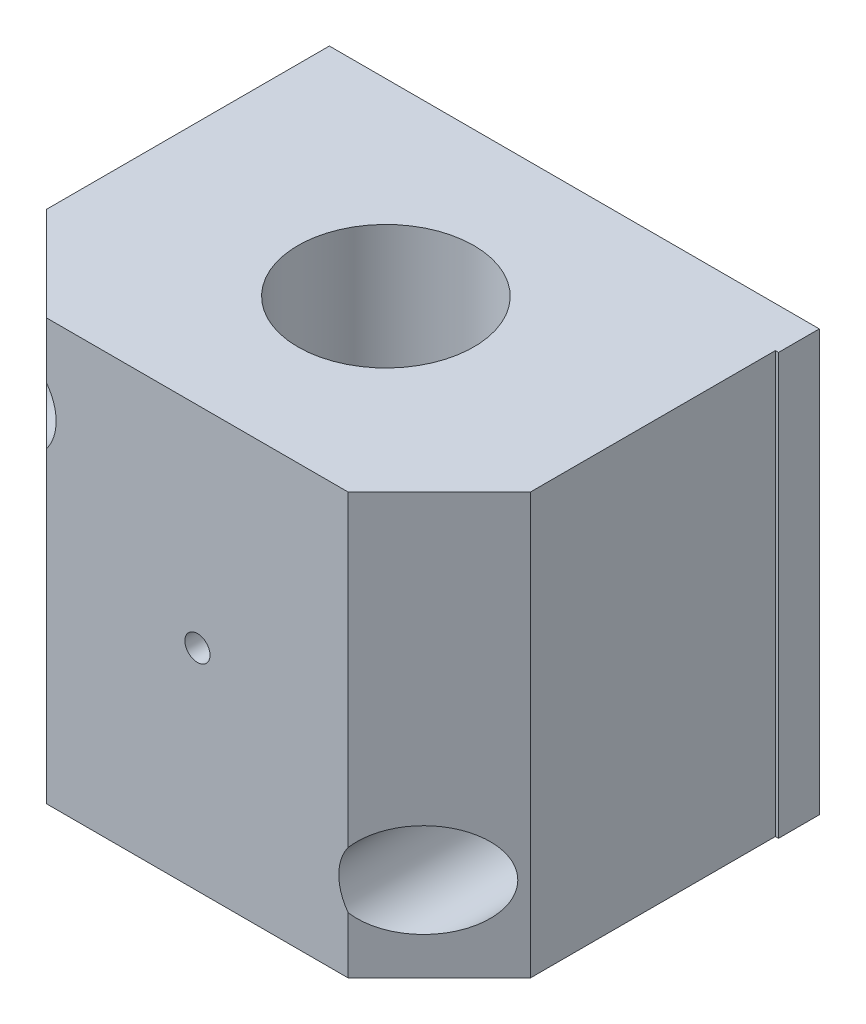
ISO-10303-21;
HEADER;
FILE_DESCRIPTION(('STEP AP214'),'2;1');
FILE_NAME('part.step','',(''),(''),'','','');
FILE_SCHEMA(('AUTOMOTIVE_DESIGN { 1 0 10303 214 1 1 1 1 }'));
ENDSEC;
DATA;
#1=APPLICATION_CONTEXT('core data for automotive mechanical design processes');
#2=APPLICATION_PROTOCOL_DEFINITION('international standard','automotive_design',2000,#1);
#3=PRODUCT_CONTEXT('',#1,'mechanical');
#4=PRODUCT('Part','Part','',(#3));
#5=PRODUCT_RELATED_PRODUCT_CATEGORY('part','',(#4));
#6=PRODUCT_DEFINITION_FORMATION('','',#4);
#7=PRODUCT_DEFINITION_CONTEXT('part definition',#1,'design');
#8=PRODUCT_DEFINITION('design','',#6,#7);
#9=PRODUCT_DEFINITION_SHAPE('','',#8);
#10=(LENGTH_UNIT() NAMED_UNIT(*) SI_UNIT(.MILLI.,.METRE.));
#11=(NAMED_UNIT(*) PLANE_ANGLE_UNIT() SI_UNIT($,.RADIAN.));
#12=(NAMED_UNIT(*) SI_UNIT($,.STERADIAN.) SOLID_ANGLE_UNIT());
#13=UNCERTAINTY_MEASURE_WITH_UNIT(LENGTH_MEASURE(1.E-05),#10,'distance_accuracy_value','');
#14=(GEOMETRIC_REPRESENTATION_CONTEXT(3) GLOBAL_UNCERTAINTY_ASSIGNED_CONTEXT((#13)) GLOBAL_UNIT_ASSIGNED_CONTEXT((#10,
#11,#12)) REPRESENTATION_CONTEXT('',''));
#15=CARTESIAN_POINT('',(0.,0.,0.));
#16=DIRECTION('',(0.,0.,1.));
#17=DIRECTION('',(1.,0.,0.));
#18=AXIS2_PLACEMENT_3D('',#15,#16,#17);
#19=CARTESIAN_POINT('',(0.,0.,0.));
#20=DIRECTION('',(0.,-1.,0.));
#21=DIRECTION('',(0.,0.,-1.));
#22=AXIS2_PLACEMENT_3D('',#19,#20,#21);
#23=CYLINDRICAL_SURFACE('',#22,14.8);
#24=CARTESIAN_POINT('',(0.,-2.5,0.));
#25=DIRECTION('',(0.,-1.,0.));
#26=DIRECTION('',(0.,0.,-1.));
#27=AXIS2_PLACEMENT_3D('',#24,#25,#26);
#28=CIRCLE('',#27,14.8);
#29=CARTESIAN_POINT('',(0.,-2.5,-14.8));
#30=VERTEX_POINT('',#29);
#31=EDGE_CURVE('E387',#30,#30,#28,.T.);
#32=ORIENTED_EDGE('',*,*,#31,.T.);
#33=EDGE_LOOP('',(#32));
#34=FACE_BOUND('',#33,.T.);
#35=CARTESIAN_POINT('',(-2.,0.,14.6642422238587));
#36=CARTESIAN_POINT('',(-1.99999502697603,-0.111685397986145,14.664243977992));
#37=CARTESIAN_POINT('',(-1.99060564217841,-0.223516310472717,14.6655329570229));
#38=CARTESIAN_POINT('',(-1.9532802267121,-0.444139583336799,14.6705500159504));
#39=CARTESIAN_POINT('',(-1.92530581415448,-0.552925168944273,14.674283143282));
#40=CARTESIAN_POINT('',(-1.85165160746117,-0.764114188634225,14.6837582194332));
#41=CARTESIAN_POINT('',(-1.80599155878306,-0.866524592920172,14.6894979272747));
#42=CARTESIAN_POINT('',(-1.69830337210463,-1.0621840516775,14.7023362626598));
#43=CARTESIAN_POINT('',(-1.63628187105767,-1.15543679991228,14.7094343388671));
#44=CARTESIAN_POINT('',(-1.49718622500393,-1.33080094244283,14.7242432719081));
#45=CARTESIAN_POINT('',(-1.42002506272147,-1.41284304396537,14.7319575105676));
#46=CARTESIAN_POINT('',(-1.25302457002495,-1.56285950520292,14.7470995583051));
#47=CARTESIAN_POINT('',(-1.16318394872685,-1.63083243080793,14.7545273381208));
#48=CARTESIAN_POINT('',(-0.972947981108538,-1.75102217234388,14.7682933334338));
#49=CARTESIAN_POINT('',(-0.872513251341285,-1.80317718862429,14.774627234775));
#50=CARTESIAN_POINT('',(-0.664211139721313,-1.88985383562431,14.7854552777885));
#51=CARTESIAN_POINT('',(-0.556344143530069,-1.92437638051476,14.7899495148373));
#52=CARTESIAN_POINT('',(-0.33693748113933,-1.974604052196,14.796568503707));
#53=CARTESIAN_POINT('',(-0.225424262205926,-1.990422792181,14.7987075561899));
#54=CARTESIAN_POINT('',(-0.00130677557033887,-2.00314616760973,14.800424070209));
#55=CARTESIAN_POINT('',(0.111297444058746,-2.00005163268465,14.8000016441045));
#56=CARTESIAN_POINT('',(0.333625479704705,-1.97512686811688,14.7966543164906));
#57=CARTESIAN_POINT('',(0.443363295261701,-1.95341900867872,14.7937457600214));
#58=CARTESIAN_POINT('',(0.657625041912521,-1.89207506639911,14.7857712185074));
#59=CARTESIAN_POINT('',(0.762148814749447,-1.85243843974996,14.7807051680228));
#60=CARTESIAN_POINT('',(0.963393283684682,-1.75623231188814,14.7689564990497));
#61=CARTESIAN_POINT('',(1.06008835387569,-1.69960984751592,14.7622688369398));
#62=CARTESIAN_POINT('',(1.24264258395931,-1.57108277453092,14.7480247948767));
#63=CARTESIAN_POINT('',(1.32850203088241,-1.49917857085959,14.740468437945));
#64=CARTESIAN_POINT('',(1.48766131506056,-1.34145952164206,14.7252612256727));
#65=CARTESIAN_POINT('',(1.56085798049676,-1.25554056322273,14.717610092945));
#66=CARTESIAN_POINT('',(1.69184207419054,-1.0725364014677,14.7031299108174));
#67=CARTESIAN_POINT('',(1.74962246904387,-0.975446130228411,14.696301237427));
#68=CARTESIAN_POINT('',(1.84813715213195,-0.772731708114038,14.6842386783276));
#69=CARTESIAN_POINT('',(1.88884816427063,-0.667096137220655,14.6790069728962));
#70=CARTESIAN_POINT('',(1.95183966772995,-0.45054294911131,14.6707650348224));
#71=CARTESIAN_POINT('',(1.97415917440213,-0.339637044031101,14.6677501010394));
#72=CARTESIAN_POINT('',(1.99132295033895,-0.189967917269284,14.6654233471142));
#73=CARTESIAN_POINT('',(1.99457434769466,-0.152053294869655,14.6649813547853));
#74=CARTESIAN_POINT('',(1.99891372038865,-0.0760980804849781,14.6643904942145));
#75=CARTESIAN_POINT('',(2.0000016945886,-0.038057488433661,14.6642416261269));
#76=CARTESIAN_POINT('',(1.99999502697603,0.111685397986145,14.664243977992));
#77=CARTESIAN_POINT('',(1.99060564217841,0.223516310472717,14.6655329570229));
#78=CARTESIAN_POINT('',(1.9532802267121,0.444139583336799,14.6705500159504));
#79=CARTESIAN_POINT('',(1.92530581415448,0.552925168944273,14.674283143282));
#80=CARTESIAN_POINT('',(1.85165160746117,0.764114188634225,14.6837582194332));
#81=CARTESIAN_POINT('',(1.80599155878306,0.866524592920172,14.6894979272747));
#82=CARTESIAN_POINT('',(1.69830337210463,1.0621840516775,14.7023362626598));
#83=CARTESIAN_POINT('',(1.63628187105767,1.15543679991228,14.7094343388671));
#84=CARTESIAN_POINT('',(1.49718622500393,1.33080094244283,14.7242432719081));
#85=CARTESIAN_POINT('',(1.42002506272147,1.41284304396538,14.7319575105676));
#86=CARTESIAN_POINT('',(1.25302457002495,1.56285950520292,14.7470995583051));
#87=CARTESIAN_POINT('',(1.16318394872685,1.63083243080793,14.7545273381208));
#88=CARTESIAN_POINT('',(0.972947981108538,1.75102217234388,14.7682933334338));
#89=CARTESIAN_POINT('',(0.872513251341285,1.80317718862429,14.774627234775));
#90=CARTESIAN_POINT('',(0.664211139721313,1.88985383562431,14.7854552777885));
#91=CARTESIAN_POINT('',(0.556344143530069,1.92437638051476,14.7899495148373));
#92=CARTESIAN_POINT('',(0.336937481139331,1.974604052196,14.796568503707));
#93=CARTESIAN_POINT('',(0.225424262205927,1.990422792181,14.7987075561899));
#94=CARTESIAN_POINT('',(0.00130677557034021,2.00314616760973,14.800424070209));
#95=CARTESIAN_POINT('',(-0.111297444058745,2.00005163268465,14.8000016441045));
#96=CARTESIAN_POINT('',(-0.333625479704704,1.97512686811688,14.7966543164906));
#97=CARTESIAN_POINT('',(-0.4433632952617,1.95341900867872,14.7937457600214));
#98=CARTESIAN_POINT('',(-0.65762504191252,1.89207506639911,14.7857712185074));
#99=CARTESIAN_POINT('',(-0.762148814749446,1.85243843974996,14.7807051680228));
#100=CARTESIAN_POINT('',(-0.963393283684681,1.75623231188814,14.7689564990497));
#101=CARTESIAN_POINT('',(-1.06008835387568,1.69960984751592,14.7622688369398));
#102=CARTESIAN_POINT('',(-1.2426425839593,1.57108277453092,14.7480247948767));
#103=CARTESIAN_POINT('',(-1.32850203088241,1.49917857085959,14.740468437945));
#104=CARTESIAN_POINT('',(-1.48766131506056,1.34145952164206,14.7252612256727));
#105=CARTESIAN_POINT('',(-1.56085798049676,1.25554056322273,14.717610092945));
#106=CARTESIAN_POINT('',(-1.69184207419054,1.0725364014677,14.7031299108174));
#107=CARTESIAN_POINT('',(-1.74962246904387,0.975446130228412,14.696301237427));
#108=CARTESIAN_POINT('',(-1.84813715213195,0.772731708114039,14.6842386783276));
#109=CARTESIAN_POINT('',(-1.88884816427063,0.667096137220656,14.6790069728962));
#110=CARTESIAN_POINT('',(-1.95183966772995,0.45054294911131,14.6707650348224));
#111=CARTESIAN_POINT('',(-1.97415917440213,0.339637044031102,14.6677501010394));
#112=CARTESIAN_POINT('',(-1.99132295033895,0.189967917269286,14.6654233471142));
#113=CARTESIAN_POINT('',(-1.99457434769466,0.152053294869656,14.6649813547853));
#114=CARTESIAN_POINT('',(-1.99891372038865,0.0760980804849788,14.6643904942145));
#115=CARTESIAN_POINT('',(-2.0000016945886,0.0380574884336613,14.6642416261269));
#116=CARTESIAN_POINT('',(-2.,0.,14.6642422238587));
#117=B_SPLINE_CURVE_WITH_KNOTS('',3,(#35,#36,#37,#38,#39,#40,#41,#42,#43,#44,#45,#46,#47,#48,
#49,#50,#51,#52,#53,#54,#55,#56,#57,#58,#59,#60,#61,#62,#63,#64,#65,#66,#67,#68,#69,#70,#71,#72,
#73,#74,#75,#76,#77,#78,#79,#80,#81,#82,#83,#84,#85,#86,#87,#88,#89,#90,#91,#92,#93,#94,#95,#96,
#97,#98,#99,#100,#101,#102,#103,#104,#105,#106,#107,#108,#109,#110,#111,#112,#113,#114,#115,
#116),.UNSPECIFIED.,.T.,.F.,(4,2,2,2,2,2,2,2,2,2,2,2,2,2,2,2,2,2,2,2,2,2,2,2,2,2,2,2,2,2,2,2,2,
2,2,2,2,2,2,2,4),(0.,0.334911080229309,0.670515979482022,1.00574726144036,1.34084276680528,
1.67792389240543,2.01503936071365,2.35345543829006,2.69185396860849,3.02818621631887,
3.36450371091429,3.6986269480006,4.03276032025002,4.36794657110965,4.70312394118104,
5.0409152889903,5.37886048569453,5.71726502307013,6.05494981448252,6.16907277133785,
6.28319578824031,6.61810686846962,6.95371176772234,7.28894304968067,7.62403855504559,
7.96111968064575,8.29823514895396,8.63665122653038,8.9750497568488,9.31138200455919,
9.6476994991546,9.98182273624091,10.3159561084903,10.65114235935,10.9863197294214,
11.3241110772306,11.6620562739348,12.0004608113104,12.3381456027228,12.4522685595782,
12.5663915764806),.UNSPECIFIED.);
#118=CARTESIAN_POINT('',(-2.,0.,14.6642422238587));
#119=VERTEX_POINT('',#118);
#120=EDGE_CURVE('E145',#119,#119,#117,.T.);
#121=ORIENTED_EDGE('',*,*,#120,.T.);
#122=EDGE_LOOP('',(#121));
#123=FACE_BOUND('',#122,.T.);
#124=CARTESIAN_POINT('',(0.,2.5,0.));
#125=DIRECTION('',(0.,-1.,0.));
#126=DIRECTION('',(0.,0.,-1.));
#127=AXIS2_PLACEMENT_3D('',#124,#125,#126);
#128=CIRCLE('',#127,14.8);
#129=CARTESIAN_POINT('',(0.,2.5,-14.8));
#130=VERTEX_POINT('',#129);
#131=EDGE_CURVE('E151',#130,#130,#128,.F.);
#132=ORIENTED_EDGE('',*,*,#131,.T.);
#133=EDGE_LOOP('',(#132));
#134=FACE_BOUND('',#133,.T.);
#135=ADVANCED_FACE('F17',(#34,#123,#134),#23,.F.);
#136=CARTESIAN_POINT('',(30.,-20.,-1.));
#137=DIRECTION('',(0.,0.,-1.));
#138=DIRECTION('',(-1.,0.,0.));
#139=AXIS2_PLACEMENT_3D('',#136,#137,#138);
#140=PLANE('',#139);
#141=CARTESIAN_POINT('',(30.,-20.,-1.));
#142=DIRECTION('',(0.,0.,1.));
#143=DIRECTION('',(1.,0.,0.));
#144=AXIS2_PLACEMENT_3D('',#141,#142,#143);
#145=CIRCLE('',#144,7.5);
#146=CARTESIAN_POINT('',(37.5,-20.,-1.));
#147=VERTEX_POINT('',#146);
#148=EDGE_CURVE('E142',#147,#147,#145,.T.);
#149=ORIENTED_EDGE('',*,*,#148,.T.);
#150=EDGE_LOOP('',(#149));
#151=FACE_BOUND('',#150,.T.);
#152=CARTESIAN_POINT('',(30.,-20.,-1.));
#153=DIRECTION('',(0.,0.,1.));
#154=DIRECTION('',(1.,0.,0.));
#155=AXIS2_PLACEMENT_3D('',#152,#153,#154);
#156=CIRCLE('',#155,4.2);
#157=CARTESIAN_POINT('',(34.2,-20.,-1.));
#158=VERTEX_POINT('',#157);
#159=EDGE_CURVE('E385',#158,#158,#156,.F.);
#160=ORIENTED_EDGE('',*,*,#159,.T.);
#161=EDGE_LOOP('',(#160));
#162=FACE_BOUND('',#161,.T.);
#163=ADVANCED_FACE('F178',(#151,#162),#140,.F.);
#164=CARTESIAN_POINT('',(-30.,20.,-1.));
#165=DIRECTION('',(0.,0.,-1.));
#166=DIRECTION('',(-1.,0.,0.));
#167=AXIS2_PLACEMENT_3D('',#164,#165,#166);
#168=PLANE('',#167);
#169=CARTESIAN_POINT('',(-30.,20.,-1.));
#170=DIRECTION('',(0.,0.,1.));
#171=DIRECTION('',(1.,0.,0.));
#172=AXIS2_PLACEMENT_3D('',#169,#170,#171);
#173=CIRCLE('',#172,7.5);
#174=CARTESIAN_POINT('',(-22.5,20.,-1.));
#175=VERTEX_POINT('',#174);
#176=EDGE_CURVE('E139',#175,#175,#173,.T.);
#177=ORIENTED_EDGE('',*,*,#176,.T.);
#178=EDGE_LOOP('',(#177));
#179=FACE_BOUND('',#178,.T.);
#180=CARTESIAN_POINT('',(-30.,20.,-1.));
#181=DIRECTION('',(0.,0.,1.));
#182=DIRECTION('',(1.,0.,0.));
#183=AXIS2_PLACEMENT_3D('',#180,#181,#182);
#184=CIRCLE('',#183,4.2);
#185=CARTESIAN_POINT('',(-25.8,20.,-1.));
#186=VERTEX_POINT('',#185);
#187=EDGE_CURVE('E21',#186,#186,#184,.F.);
#188=ORIENTED_EDGE('',*,*,#187,.T.);
#189=EDGE_LOOP('',(#188));
#190=FACE_BOUND('',#189,.T.);
#191=ADVANCED_FACE('F175',(#179,#190),#168,.F.);
#192=CARTESIAN_POINT('',(-30.,20.,22.));
#193=DIRECTION('',(0.,0.,1.));
#194=DIRECTION('',(1.,0.,0.));
#195=AXIS2_PLACEMENT_3D('',#192,#193,#194);
#196=CYLINDRICAL_SURFACE('',#195,4.2);
#197=CARTESIAN_POINT('',(-30.,20.,-8.));
#198=DIRECTION('',(0.,0.,1.));
#199=DIRECTION('',(1.,0.,0.));
#200=AXIS2_PLACEMENT_3D('',#197,#198,#199);
#201=CIRCLE('',#200,4.2);
#202=CARTESIAN_POINT('',(-25.8,20.,-8.));
#203=VERTEX_POINT('',#202);
#204=EDGE_CURVE('E136',#203,#203,#201,.F.);
#205=ORIENTED_EDGE('',*,*,#204,.T.);
#206=EDGE_LOOP('',(#205));
#207=FACE_BOUND('',#206,.T.);
#208=ORIENTED_EDGE('',*,*,#187,.F.);
#209=EDGE_LOOP('',(#208));
#210=FACE_BOUND('',#209,.T.);
#211=ADVANCED_FACE('F171',(#207,#210),#196,.F.);
#212=CARTESIAN_POINT('',(30.,-20.,22.));
#213=DIRECTION('',(0.,0.,1.));
#214=DIRECTION('',(1.,0.,0.));
#215=AXIS2_PLACEMENT_3D('',#212,#213,#214);
#216=CYLINDRICAL_SURFACE('',#215,4.2);
#217=CARTESIAN_POINT('',(30.,-20.,-8.));
#218=DIRECTION('',(0.,0.,1.));
#219=DIRECTION('',(1.,0.,0.));
#220=AXIS2_PLACEMENT_3D('',#217,#218,#219);
#221=CIRCLE('',#220,4.2);
#222=CARTESIAN_POINT('',(34.2,-20.,-8.));
#223=VERTEX_POINT('',#222);
#224=EDGE_CURVE('E133',#223,#223,#221,.F.);
#225=ORIENTED_EDGE('',*,*,#224,.T.);
#226=EDGE_LOOP('',(#225));
#227=FACE_BOUND('',#226,.T.);
#228=ORIENTED_EDGE('',*,*,#159,.F.);
#229=EDGE_LOOP('',(#228));
#230=FACE_BOUND('',#229,.T.);
#231=ADVANCED_FACE('F167',(#227,#230),#216,.F.);
#232=CARTESIAN_POINT('',(0.,-2.5,0.));
#233=DIRECTION('',(0.,-1.,0.));
#234=DIRECTION('',(0.,0.,-1.));
#235=AXIS2_PLACEMENT_3D('',#232,#233,#234);
#236=PLANE('',#235);
#237=ORIENTED_EDGE('',*,*,#31,.F.);
#238=EDGE_LOOP('',(#237));
#239=FACE_BOUND('',#238,.T.);
#240=CARTESIAN_POINT('',(0.,-2.5,0.));
#241=DIRECTION('',(0.,-1.,0.));
#242=DIRECTION('',(0.,0.,-1.));
#243=AXIS2_PLACEMENT_3D('',#240,#241,#242);
#244=CIRCLE('',#243,14.);
#245=CARTESIAN_POINT('',(0.,-2.5,-14.));
#246=VERTEX_POINT('',#245);
#247=EDGE_CURVE('E130',#246,#246,#244,.T.);
#248=ORIENTED_EDGE('',*,*,#247,.T.);
#249=EDGE_LOOP('',(#248));
#250=FACE_BOUND('',#249,.T.);
#251=ADVANCED_FACE('F163',(#239,#250),#236,.F.);
#252=CARTESIAN_POINT('',(0.,2.5,0.));
#253=DIRECTION('',(0.,1.,0.));
#254=DIRECTION('',(0.,0.,1.));
#255=AXIS2_PLACEMENT_3D('',#252,#253,#254);
#256=PLANE('',#255);
#257=ORIENTED_EDGE('',*,*,#131,.F.);
#258=EDGE_LOOP('',(#257));
#259=FACE_BOUND('',#258,.T.);
#260=CARTESIAN_POINT('',(0.,2.5,0.));
#261=DIRECTION('',(0.,-1.,0.));
#262=DIRECTION('',(0.,0.,-1.));
#263=AXIS2_PLACEMENT_3D('',#260,#261,#262);
#264=CIRCLE('',#263,14.);
#265=CARTESIAN_POINT('',(0.,2.5,-14.));
#266=VERTEX_POINT('',#265);
#267=EDGE_CURVE('E101',#266,#266,#264,.F.);
#268=ORIENTED_EDGE('',*,*,#267,.T.);
#269=EDGE_LOOP('',(#268));
#270=FACE_BOUND('',#269,.T.);
#271=ADVANCED_FACE('F158',(#259,#270),#256,.F.);
#272=CARTESIAN_POINT('',(0.,0.,22.5));
#273=DIRECTION('',(0.,0.,1.));
#274=DIRECTION('',(1.,0.,0.));
#275=AXIS2_PLACEMENT_3D('',#272,#273,#274);
#276=CYLINDRICAL_SURFACE('',#275,2.);
#277=ORIENTED_EDGE('',*,*,#120,.F.);
#278=EDGE_LOOP('',(#277));
#279=FACE_BOUND('',#278,.T.);
#280=CARTESIAN_POINT('',(0.,0.,30.));
#281=DIRECTION('',(0.,0.,1.));
#282=DIRECTION('',(1.,0.,0.));
#283=AXIS2_PLACEMENT_3D('',#280,#281,#282);
#284=CIRCLE('',#283,2.);
#285=CARTESIAN_POINT('',(2.,0.,30.));
#286=VERTEX_POINT('',#285);
#287=EDGE_CURVE('E125',#286,#286,#284,.F.);
#288=ORIENTED_EDGE('',*,*,#287,.F.);
#289=EDGE_LOOP('',(#288));
#290=FACE_BOUND('',#289,.T.);
#291=ADVANCED_FACE('F153',(#279,#290),#276,.F.);
#292=CARTESIAN_POINT('',(30.,-20.,29.));
#293=DIRECTION('',(0.,0.,1.));
#294=DIRECTION('',(1.,0.,0.));
#295=AXIS2_PLACEMENT_3D('',#292,#293,#294);
#296=CYLINDRICAL_SURFACE('',#295,7.5);
#297=CARTESIAN_POINT('',(30.,-20.,30.));
#298=DIRECTION('',(0.,0.,1.));
#299=DIRECTION('',(1.,0.,0.));
#300=AXIS2_PLACEMENT_3D('',#297,#298,#299);
#301=CIRCLE('',#300,7.5);
#302=CARTESIAN_POINT('',(24.,-24.5,30.));
#303=VERTEX_POINT('',#302);
#304=CARTESIAN_POINT('',(24.,-15.5,30.));
#305=VERTEX_POINT('',#304);
#306=EDGE_CURVE('E92',#303,#305,#301,.F.);
#307=ORIENTED_EDGE('',*,*,#306,.F.);
#308=CARTESIAN_POINT('',(30.,-20.,24.));
#309=DIRECTION('',(0.707106781186548,0.,0.707106781186547));
#310=DIRECTION('',(-0.707106781186547,0.,0.707106781186548));
#311=AXIS2_PLACEMENT_3D('',#308,#309,#310);
#312=ELLIPSE('',#311,10.6066017177982,7.5);
#313=EDGE_CURVE('E94',#305,#303,#312,.F.);
#314=ORIENTED_EDGE('',*,*,#313,.F.);
#315=EDGE_LOOP('',(#307,#314));
#316=FACE_BOUND('',#315,.T.);
#317=ORIENTED_EDGE('',*,*,#148,.F.);
#318=EDGE_LOOP('',(#317));
#319=FACE_BOUND('',#318,.T.);
#320=ADVANCED_FACE('F96',(#316,#319),#296,.F.);
#321=CARTESIAN_POINT('',(-30.,20.,29.));
#322=DIRECTION('',(0.,0.,1.));
#323=DIRECTION('',(1.,0.,0.));
#324=AXIS2_PLACEMENT_3D('',#321,#322,#323);
#325=CYLINDRICAL_SURFACE('',#324,7.5);
#326=ORIENTED_EDGE('',*,*,#176,.F.);
#327=EDGE_LOOP('',(#326));
#328=FACE_BOUND('',#327,.T.);
#329=CARTESIAN_POINT('',(-30.,20.,30.));
#330=DIRECTION('',(0.,0.,1.));
#331=DIRECTION('',(1.,0.,0.));
#332=AXIS2_PLACEMENT_3D('',#329,#330,#331);
#333=CIRCLE('',#332,7.5);
#334=CARTESIAN_POINT('',(-24.,24.5,30.));
#335=VERTEX_POINT('',#334);
#336=CARTESIAN_POINT('',(-24.,15.5,30.));
#337=VERTEX_POINT('',#336);
#338=EDGE_CURVE('E118',#335,#337,#333,.F.);
#339=ORIENTED_EDGE('',*,*,#338,.F.);
#340=CARTESIAN_POINT('',(-30.,20.,24.));
#341=DIRECTION('',(-0.707106781186548,0.,0.707106781186548));
#342=DIRECTION('',(0.707106781186548,0.,0.707106781186548));
#343=AXIS2_PLACEMENT_3D('',#340,#341,#342);
#344=ELLIPSE('',#343,10.6066017177982,7.5);
#345=EDGE_CURVE('E111',#337,#335,#344,.F.);
#346=ORIENTED_EDGE('',*,*,#345,.F.);
#347=EDGE_LOOP('',(#339,#346));
#348=FACE_BOUND('',#347,.T.);
#349=ADVANCED_FACE('F252',(#328,#348),#325,.F.);
#350=CARTESIAN_POINT('',(-30.,20.,-8.));
#351=DIRECTION('',(0.,0.,-1.));
#352=DIRECTION('',(-1.,0.,0.));
#353=AXIS2_PLACEMENT_3D('',#350,#351,#352);
#354=PLANE('',#353);
#355=ORIENTED_EDGE('',*,*,#204,.F.);
#356=EDGE_LOOP('',(#355));
#357=FACE_BOUND('',#356,.T.);
#358=CARTESIAN_POINT('',(-30.,20.,-8.));
#359=DIRECTION('',(0.,0.,-1.));
#360=DIRECTION('',(0.,1.,0.));
#361=AXIS2_PLACEMENT_3D('',#358,#359,#360);
#362=CIRCLE('',#361,4.188);
#363=CARTESIAN_POINT('',(-30.,24.188,-8.));
#364=VERTEX_POINT('',#363);
#365=EDGE_CURVE('E277',#364,#364,#362,.T.);
#366=ORIENTED_EDGE('',*,*,#365,.T.);
#367=EDGE_LOOP('',(#366));
#368=FACE_BOUND('',#367,.T.);
#369=ADVANCED_FACE('F249',(#357,#368),#354,.F.);
#370=CARTESIAN_POINT('',(30.,-20.,-8.));
#371=DIRECTION('',(0.,0.,-1.));
#372=DIRECTION('',(-1.,0.,0.));
#373=AXIS2_PLACEMENT_3D('',#370,#371,#372);
#374=PLANE('',#373);
#375=ORIENTED_EDGE('',*,*,#224,.F.);
#376=EDGE_LOOP('',(#375));
#377=FACE_BOUND('',#376,.T.);
#378=CARTESIAN_POINT('',(30.,-20.,-8.));
#379=DIRECTION('',(0.,0.,-1.));
#380=DIRECTION('',(0.,1.,0.));
#381=AXIS2_PLACEMENT_3D('',#378,#379,#380);
#382=CIRCLE('',#381,4.188);
#383=CARTESIAN_POINT('',(30.,-15.812,-8.));
#384=VERTEX_POINT('',#383);
#385=EDGE_CURVE('E333',#384,#384,#382,.T.);
#386=ORIENTED_EDGE('',*,*,#385,.T.);
#387=EDGE_LOOP('',(#386));
#388=FACE_BOUND('',#387,.T.);
#389=ADVANCED_FACE('F245',(#377,#388),#374,.F.);
#390=CARTESIAN_POINT('',(0.,-16.75,0.));
#391=DIRECTION('',(0.,-1.,0.));
#392=DIRECTION('',(0.,0.,-1.));
#393=AXIS2_PLACEMENT_3D('',#390,#391,#392);
#394=CYLINDRICAL_SURFACE('',#393,14.);
#395=ORIENTED_EDGE('',*,*,#247,.F.);
#396=EDGE_LOOP('',(#395));
#397=FACE_BOUND('',#396,.T.);
#398=CARTESIAN_POINT('',(0.,-33.5,0.));
#399=DIRECTION('',(0.,-1.,0.));
#400=DIRECTION('',(0.,0.,-1.));
#401=AXIS2_PLACEMENT_3D('',#398,#399,#400);
#402=CIRCLE('',#401,14.);
#403=CARTESIAN_POINT('',(0.,-33.5,-14.));
#404=VERTEX_POINT('',#403);
#405=EDGE_CURVE('E329',#404,#404,#402,.F.);
#406=ORIENTED_EDGE('',*,*,#405,.F.);
#407=EDGE_LOOP('',(#406));
#408=FACE_BOUND('',#407,.T.);
#409=ADVANCED_FACE('F241',(#397,#408),#394,.F.);
#410=CARTESIAN_POINT('',(0.,-16.75,0.));
#411=DIRECTION('',(0.,-1.,0.));
#412=DIRECTION('',(0.,0.,-1.));
#413=AXIS2_PLACEMENT_3D('',#410,#411,#412);
#414=CYLINDRICAL_SURFACE('',#413,14.);
#415=ORIENTED_EDGE('',*,*,#267,.F.);
#416=EDGE_LOOP('',(#415));
#417=FACE_BOUND('',#416,.T.);
#418=CARTESIAN_POINT('',(0.,33.5,0.));
#419=DIRECTION('',(0.,-1.,0.));
#420=DIRECTION('',(0.,0.,-1.));
#421=AXIS2_PLACEMENT_3D('',#418,#419,#420);
#422=CIRCLE('',#421,14.);
#423=CARTESIAN_POINT('',(0.,33.5,-14.));
#424=VERTEX_POINT('',#423);
#425=EDGE_CURVE('E324',#424,#424,#422,.F.);
#426=ORIENTED_EDGE('',*,*,#425,.T.);
#427=EDGE_LOOP('',(#426));
#428=FACE_BOUND('',#427,.T.);
#429=ADVANCED_FACE('F237',(#417,#428),#414,.F.);
#430=CARTESIAN_POINT('',(38.5,33.5,-4.));
#431=DIRECTION('',(1.,0.,0.));
#432=DIRECTION('',(0.,0.,-1.));
#433=AXIS2_PLACEMENT_3D('',#430,#431,#432);
#434=PLANE('',#433);
#435=DIRECTION('',(0.,0.,-1.));
#436=VECTOR('',#435,1.);
#437=CARTESIAN_POINT('',(38.5,33.5,-2.45561202272206));
#438=LINE('',#437,#436);
#439=CARTESIAN_POINT('',(38.5,33.5,-23.5));
#440=VERTEX_POINT('',#439);
#441=CARTESIAN_POINT('',(38.5,33.5,15.5));
#442=VERTEX_POINT('',#441);
#443=EDGE_CURVE('E308',#440,#442,#438,.F.);
#444=ORIENTED_EDGE('',*,*,#443,.T.);
#445=DIRECTION('',(0.,1.,0.));
#446=VECTOR('',#445,1.);
#447=CARTESIAN_POINT('',(38.5,33.5,15.5));
#448=LINE('',#447,#446);
#449=CARTESIAN_POINT('',(38.5,-33.5,15.5));
#450=VERTEX_POINT('',#449);
#451=EDGE_CURVE('E100',#450,#442,#448,.T.);
#452=ORIENTED_EDGE('',*,*,#451,.F.);
#453=DIRECTION('',(0.,0.,-1.));
#454=VECTOR('',#453,1.);
#455=CARTESIAN_POINT('',(38.5,-33.5,-2.45561202272206));
#456=LINE('',#455,#454);
#457=CARTESIAN_POINT('',(38.5,-33.5,-23.5));
#458=VERTEX_POINT('',#457);
#459=EDGE_CURVE('E313',#458,#450,#456,.F.);
#460=ORIENTED_EDGE('',*,*,#459,.F.);
#461=DIRECTION('',(0.,-1.,0.));
#462=VECTOR('',#461,1.);
#463=CARTESIAN_POINT('',(38.5,33.5,-23.5));
#464=LINE('',#463,#462);
#465=EDGE_CURVE('E275',#440,#458,#464,.T.);
#466=ORIENTED_EDGE('',*,*,#465,.F.);
#467=EDGE_LOOP('',(#444,#452,#460,#466));
#468=FACE_BOUND('',#467,.T.);
#469=ADVANCED_FACE('F234',(#468),#434,.T.);
#470=CARTESIAN_POINT('',(31.25,33.5,22.75));
#471=DIRECTION('',(0.707106781186548,0.,0.707106781186547));
#472=DIRECTION('',(0.707106781186547,0.,-0.707106781186548));
#473=AXIS2_PLACEMENT_3D('',#470,#471,#472);
#474=PLANE('',#473);
#475=DIRECTION('',(-0.707106781186548,0.,0.707106781186548));
#476=VECTOR('',#475,1.);
#477=CARTESIAN_POINT('',(38.5,33.5,15.5));
#478=LINE('',#477,#476);
#479=CARTESIAN_POINT('',(24.,33.5,30.));
#480=VERTEX_POINT('',#479);
#481=EDGE_CURVE('E108',#442,#480,#478,.T.);
#482=ORIENTED_EDGE('',*,*,#481,.T.);
#483=DIRECTION('',(0.,-1.,0.));
#484=VECTOR('',#483,1.);
#485=CARTESIAN_POINT('',(24.,33.5,30.));
#486=LINE('',#485,#484);
#487=EDGE_CURVE('E104',#305,#480,#486,.F.);
#488=ORIENTED_EDGE('',*,*,#487,.F.);
#489=ORIENTED_EDGE('',*,*,#313,.T.);
#490=DIRECTION('',(0.,-1.,0.));
#491=VECTOR('',#490,1.);
#492=CARTESIAN_POINT('',(24.,33.5,30.));
#493=LINE('',#492,#491);
#494=CARTESIAN_POINT('',(24.,-33.5,30.));
#495=VERTEX_POINT('',#494);
#496=EDGE_CURVE('E116',#495,#303,#493,.F.);
#497=ORIENTED_EDGE('',*,*,#496,.F.);
#498=DIRECTION('',(-0.707106781186548,0.,0.707106781186548));
#499=VECTOR('',#498,1.);
#500=CARTESIAN_POINT('',(38.5,-33.5,15.5));
#501=LINE('',#500,#499);
#502=EDGE_CURVE('E296',#450,#495,#501,.T.);
#503=ORIENTED_EDGE('',*,*,#502,.F.);
#504=ORIENTED_EDGE('',*,*,#451,.T.);
#505=EDGE_LOOP('',(#482,#488,#489,#497,#503,#504));
#506=FACE_BOUND('',#505,.T.);
#507=ADVANCED_FACE('F105',(#506),#474,.T.);
#508=CARTESIAN_POINT('',(0.,33.5,30.));
#509=DIRECTION('',(0.,0.,1.));
#510=DIRECTION('',(0.,-1.,0.));
#511=AXIS2_PLACEMENT_3D('',#508,#509,#510);
#512=PLANE('',#511);
#513=DIRECTION('',(1.,0.,0.));
#514=VECTOR('',#513,1.);
#515=CARTESIAN_POINT('',(-0.0310196717762703,33.5,30.));
#516=LINE('',#515,#514);
#517=CARTESIAN_POINT('',(-24.,33.5,30.));
#518=VERTEX_POINT('',#517);
#519=EDGE_CURVE('E267',#480,#518,#516,.F.);
#520=ORIENTED_EDGE('',*,*,#519,.T.);
#521=DIRECTION('',(0.,1.,0.));
#522=VECTOR('',#521,1.);
#523=CARTESIAN_POINT('',(-24.,33.5,30.));
#524=LINE('',#523,#522);
#525=EDGE_CURVE('E266',#335,#518,#524,.T.);
#526=ORIENTED_EDGE('',*,*,#525,.F.);
#527=ORIENTED_EDGE('',*,*,#338,.T.);
#528=DIRECTION('',(0.,1.,0.));
#529=VECTOR('',#528,1.);
#530=CARTESIAN_POINT('',(-24.,33.5,30.));
#531=LINE('',#530,#529);
#532=CARTESIAN_POINT('',(-24.,-33.5,30.));
#533=VERTEX_POINT('',#532);
#534=EDGE_CURVE('E269',#533,#337,#531,.T.);
#535=ORIENTED_EDGE('',*,*,#534,.F.);
#536=DIRECTION('',(1.,0.,0.));
#537=VECTOR('',#536,1.);
#538=CARTESIAN_POINT('',(-0.0310196717762703,-33.5,30.));
#539=LINE('',#538,#537);
#540=EDGE_CURVE('E292',#495,#533,#539,.F.);
#541=ORIENTED_EDGE('',*,*,#540,.F.);
#542=ORIENTED_EDGE('',*,*,#496,.T.);
#543=ORIENTED_EDGE('',*,*,#306,.T.);
#544=ORIENTED_EDGE('',*,*,#487,.T.);
#545=EDGE_LOOP('',(#520,#526,#527,#535,#541,#542,#543,#544));
#546=FACE_BOUND('',#545,.T.);
#547=ORIENTED_EDGE('',*,*,#287,.T.);
#548=EDGE_LOOP('',(#547));
#549=FACE_BOUND('',#548,.T.);
#550=ADVANCED_FACE('F113',(#546,#549),#512,.T.);
#551=CARTESIAN_POINT('',(-31.5,33.5,22.5));
#552=DIRECTION('',(-0.707106781186548,0.,0.707106781186548));
#553=DIRECTION('',(0.707106781186548,0.,0.707106781186548));
#554=AXIS2_PLACEMENT_3D('',#551,#552,#553);
#555=PLANE('',#554);
#556=DIRECTION('',(-0.707106781186548,0.,-0.707106781186548));
#557=VECTOR('',#556,1.);
#558=CARTESIAN_POINT('',(-24.,-33.5,30.));
#559=LINE('',#558,#557);
#560=CARTESIAN_POINT('',(-39.,-33.5,15.));
#561=VERTEX_POINT('',#560);
#562=EDGE_CURVE('E273',#533,#561,#559,.T.);
#563=ORIENTED_EDGE('',*,*,#562,.F.);
#564=ORIENTED_EDGE('',*,*,#534,.T.);
#565=ORIENTED_EDGE('',*,*,#345,.T.);
#566=ORIENTED_EDGE('',*,*,#525,.T.);
#567=DIRECTION('',(-0.707106781186548,0.,-0.707106781186548));
#568=VECTOR('',#567,1.);
#569=CARTESIAN_POINT('',(-24.,33.5,30.));
#570=LINE('',#569,#568);
#571=CARTESIAN_POINT('',(-39.,33.5,15.));
#572=VERTEX_POINT('',#571);
#573=EDGE_CURVE('E300',#518,#572,#570,.T.);
#574=ORIENTED_EDGE('',*,*,#573,.T.);
#575=DIRECTION('',(0.,1.,0.));
#576=VECTOR('',#575,1.);
#577=CARTESIAN_POINT('',(-39.,33.5,15.));
#578=LINE('',#577,#576);
#579=EDGE_CURVE('E328',#561,#572,#578,.T.);
#580=ORIENTED_EDGE('',*,*,#579,.F.);
#581=EDGE_LOOP('',(#563,#564,#565,#566,#574,#580));
#582=FACE_BOUND('',#581,.T.);
#583=ADVANCED_FACE('F225',(#582),#555,.T.);
#584=CARTESIAN_POINT('',(38.75,33.5,-23.5));
#585=DIRECTION('',(0.,0.,1.));
#586=DIRECTION('',(0.,-1.,0.));
#587=AXIS2_PLACEMENT_3D('',#584,#585,#586);
#588=PLANE('',#587);
#589=DIRECTION('',(1.,0.,0.));
#590=VECTOR('',#589,1.);
#591=CARTESIAN_POINT('',(-0.0310196717762703,33.5,-23.5));
#592=LINE('',#591,#590);
#593=CARTESIAN_POINT('',(39.,33.5,-23.5));
#594=VERTEX_POINT('',#593);
#595=EDGE_CURVE('E327',#594,#440,#592,.F.);
#596=ORIENTED_EDGE('',*,*,#595,.T.);
#597=ORIENTED_EDGE('',*,*,#465,.T.);
#598=DIRECTION('',(1.,0.,0.));
#599=VECTOR('',#598,1.);
#600=CARTESIAN_POINT('',(-0.0310196717762703,-33.5,-23.5));
#601=LINE('',#600,#599);
#602=CARTESIAN_POINT('',(39.,-33.5,-23.5));
#603=VERTEX_POINT('',#602);
#604=EDGE_CURVE('E332',#603,#458,#601,.F.);
#605=ORIENTED_EDGE('',*,*,#604,.F.);
#606=DIRECTION('',(0.,1.,0.));
#607=VECTOR('',#606,1.);
#608=CARTESIAN_POINT('',(39.,33.5,-23.5));
#609=LINE('',#608,#607);
#610=EDGE_CURVE('E323',#594,#603,#609,.F.);
#611=ORIENTED_EDGE('',*,*,#610,.F.);
#612=EDGE_LOOP('',(#596,#597,#605,#611));
#613=FACE_BOUND('',#612,.T.);
#614=ADVANCED_FACE('F221',(#613),#588,.T.);
#615=CARTESIAN_POINT('',(-30.,20.,-19.));
#616=DIRECTION('',(0.,0.,-1.));
#617=DIRECTION('',(0.,1.,0.));
#618=AXIS2_PLACEMENT_3D('',#615,#616,#617);
#619=CYLINDRICAL_SURFACE('',#618,4.188);
#620=CARTESIAN_POINT('',(-30.,20.,-30.));
#621=DIRECTION('',(0.,0.,-1.));
#622=DIRECTION('',(0.,1.,0.));
#623=AXIS2_PLACEMENT_3D('',#620,#621,#622);
#624=CIRCLE('',#623,4.188);
#625=CARTESIAN_POINT('',(-30.,24.188,-30.));
#626=VERTEX_POINT('',#625);
#627=EDGE_CURVE('E320',#626,#626,#624,.F.);
#628=ORIENTED_EDGE('',*,*,#627,.F.);
#629=EDGE_LOOP('',(#628));
#630=FACE_BOUND('',#629,.T.);
#631=ORIENTED_EDGE('',*,*,#365,.F.);
#632=EDGE_LOOP('',(#631));
#633=FACE_BOUND('',#632,.T.);
#634=ADVANCED_FACE('F217',(#630,#633),#619,.F.);
#635=CARTESIAN_POINT('',(30.,-20.,-19.));
#636=DIRECTION('',(0.,0.,-1.));
#637=DIRECTION('',(0.,1.,0.));
#638=AXIS2_PLACEMENT_3D('',#635,#636,#637);
#639=CYLINDRICAL_SURFACE('',#638,4.188);
#640=CARTESIAN_POINT('',(30.,-20.,-30.));
#641=DIRECTION('',(0.,0.,-1.));
#642=DIRECTION('',(0.,1.,0.));
#643=AXIS2_PLACEMENT_3D('',#640,#641,#642);
#644=CIRCLE('',#643,4.188);
#645=CARTESIAN_POINT('',(30.,-15.812,-30.));
#646=VERTEX_POINT('',#645);
#647=EDGE_CURVE('E316',#646,#646,#644,.F.);
#648=ORIENTED_EDGE('',*,*,#647,.F.);
#649=EDGE_LOOP('',(#648));
#650=FACE_BOUND('',#649,.T.);
#651=ORIENTED_EDGE('',*,*,#385,.F.);
#652=EDGE_LOOP('',(#651));
#653=FACE_BOUND('',#652,.T.);
#654=ADVANCED_FACE('F213',(#650,#653),#639,.F.);
#655=CARTESIAN_POINT('',(-0.0310196717762703,-33.5,-2.45561202272206));
#656=DIRECTION('',(0.,-1.,0.));
#657=DIRECTION('',(0.,0.,-1.));
#658=AXIS2_PLACEMENT_3D('',#655,#656,#657);
#659=PLANE('',#658);
#660=ORIENTED_EDGE('',*,*,#540,.T.);
#661=ORIENTED_EDGE('',*,*,#562,.T.);
#662=DIRECTION('',(0.,0.,1.));
#663=VECTOR('',#662,1.);
#664=CARTESIAN_POINT('',(-39.,-33.5,-7.5));
#665=LINE('',#664,#663);
#666=CARTESIAN_POINT('',(-39.,-33.5,-30.));
#667=VERTEX_POINT('',#666);
#668=EDGE_CURVE('E291',#667,#561,#665,.T.);
#669=ORIENTED_EDGE('',*,*,#668,.F.);
#670=DIRECTION('',(1.,0.,0.));
#671=VECTOR('',#670,1.);
#672=CARTESIAN_POINT('',(-19.5,-33.5,-30.));
#673=LINE('',#672,#671);
#674=CARTESIAN_POINT('',(39.,-33.5,-30.));
#675=VERTEX_POINT('',#674);
#676=EDGE_CURVE('E319',#675,#667,#673,.F.);
#677=ORIENTED_EDGE('',*,*,#676,.F.);
#678=DIRECTION('',(0.,0.,-1.));
#679=VECTOR('',#678,1.);
#680=CARTESIAN_POINT('',(39.,-33.5,-26.75));
#681=LINE('',#680,#679);
#682=EDGE_CURVE('E357',#603,#675,#681,.T.);
#683=ORIENTED_EDGE('',*,*,#682,.F.);
#684=ORIENTED_EDGE('',*,*,#604,.T.);
#685=ORIENTED_EDGE('',*,*,#459,.T.);
#686=ORIENTED_EDGE('',*,*,#502,.T.);
#687=EDGE_LOOP('',(#660,#661,#669,#677,#683,#684,#685,#686));
#688=FACE_BOUND('',#687,.T.);
#689=ORIENTED_EDGE('',*,*,#405,.T.);
#690=EDGE_LOOP('',(#689));
#691=FACE_BOUND('',#690,.T.);
#692=ADVANCED_FACE('F209',(#688,#691),#659,.T.);
#693=CARTESIAN_POINT('',(-39.,33.5,-7.5));
#694=DIRECTION('',(-1.,0.,0.));
#695=DIRECTION('',(0.,0.,1.));
#696=AXIS2_PLACEMENT_3D('',#693,#694,#695);
#697=PLANE('',#696);
#698=DIRECTION('',(0.,0.,-1.));
#699=VECTOR('',#698,1.);
#700=CARTESIAN_POINT('',(-39.,33.5,-2.45561202272206));
#701=LINE('',#700,#699);
#702=CARTESIAN_POINT('',(-39.,33.5,-30.));
#703=VERTEX_POINT('',#702);
#704=EDGE_CURVE('E304',#572,#703,#701,.T.);
#705=ORIENTED_EDGE('',*,*,#704,.T.);
#706=DIRECTION('',(0.,1.,0.));
#707=VECTOR('',#706,1.);
#708=CARTESIAN_POINT('',(-39.,33.5,-30.));
#709=LINE('',#708,#707);
#710=EDGE_CURVE('E365',#667,#703,#709,.T.);
#711=ORIENTED_EDGE('',*,*,#710,.F.);
#712=ORIENTED_EDGE('',*,*,#668,.T.);
#713=ORIENTED_EDGE('',*,*,#579,.T.);
#714=EDGE_LOOP('',(#705,#711,#712,#713));
#715=FACE_BOUND('',#714,.T.);
#716=ADVANCED_FACE('F206',(#715),#697,.T.);
#717=CARTESIAN_POINT('',(-0.0310196717762703,33.5,-2.45561202272206));
#718=DIRECTION('',(0.,-1.,0.));
#719=DIRECTION('',(0.,0.,-1.));
#720=AXIS2_PLACEMENT_3D('',#717,#718,#719);
#721=PLANE('',#720);
#722=ORIENTED_EDGE('',*,*,#704,.F.);
#723=ORIENTED_EDGE('',*,*,#573,.F.);
#724=ORIENTED_EDGE('',*,*,#519,.F.);
#725=ORIENTED_EDGE('',*,*,#481,.F.);
#726=ORIENTED_EDGE('',*,*,#443,.F.);
#727=ORIENTED_EDGE('',*,*,#595,.F.);
#728=DIRECTION('',(0.,0.,-1.));
#729=VECTOR('',#728,1.);
#730=CARTESIAN_POINT('',(39.,33.5,-26.75));
#731=LINE('',#730,#729);
#732=CARTESIAN_POINT('',(39.,33.5,-30.));
#733=VERTEX_POINT('',#732);
#734=EDGE_CURVE('E36',#733,#594,#731,.F.);
#735=ORIENTED_EDGE('',*,*,#734,.F.);
#736=DIRECTION('',(1.,0.,0.));
#737=VECTOR('',#736,1.);
#738=CARTESIAN_POINT('',(-19.5,33.5,-30.));
#739=LINE('',#738,#737);
#740=EDGE_CURVE('E27',#703,#733,#739,.T.);
#741=ORIENTED_EDGE('',*,*,#740,.F.);
#742=EDGE_LOOP('',(#722,#723,#724,#725,#726,#727,#735,#741));
#743=FACE_BOUND('',#742,.T.);
#744=ORIENTED_EDGE('',*,*,#425,.F.);
#745=EDGE_LOOP('',(#744));
#746=FACE_BOUND('',#745,.T.);
#747=ADVANCED_FACE('F198',(#743,#746),#721,.F.);
#748=CARTESIAN_POINT('',(39.,33.5,-26.75));
#749=DIRECTION('',(1.,0.,0.));
#750=DIRECTION('',(0.,0.,-1.));
#751=AXIS2_PLACEMENT_3D('',#748,#749,#750);
#752=PLANE('',#751);
#753=ORIENTED_EDGE('',*,*,#734,.T.);
#754=ORIENTED_EDGE('',*,*,#610,.T.);
#755=ORIENTED_EDGE('',*,*,#682,.T.);
#756=DIRECTION('',(0.,1.,0.));
#757=VECTOR('',#756,1.);
#758=CARTESIAN_POINT('',(39.,33.5,-30.));
#759=LINE('',#758,#757);
#760=EDGE_CURVE('E11',#733,#675,#759,.F.);
#761=ORIENTED_EDGE('',*,*,#760,.F.);
#762=EDGE_LOOP('',(#753,#754,#755,#761));
#763=FACE_BOUND('',#762,.T.);
#764=ADVANCED_FACE('F191',(#763),#752,.T.);
#765=CARTESIAN_POINT('',(-19.5,33.5,-30.));
#766=DIRECTION('',(0.,0.,-1.));
#767=DIRECTION('',(0.,1.,0.));
#768=AXIS2_PLACEMENT_3D('',#765,#766,#767);
#769=PLANE('',#768);
#770=ORIENTED_EDGE('',*,*,#740,.T.);
#771=ORIENTED_EDGE('',*,*,#760,.T.);
#772=ORIENTED_EDGE('',*,*,#676,.T.);
#773=ORIENTED_EDGE('',*,*,#710,.T.);
#774=EDGE_LOOP('',(#770,#771,#772,#773));
#775=FACE_BOUND('',#774,.T.);
#776=ORIENTED_EDGE('',*,*,#647,.T.);
#777=EDGE_LOOP('',(#776));
#778=FACE_BOUND('',#777,.T.);
#779=ORIENTED_EDGE('',*,*,#627,.T.);
#780=EDGE_LOOP('',(#779));
#781=FACE_BOUND('',#780,.T.);
#782=ADVANCED_FACE('F189',(#775,#778,#781),#769,.T.);
#783=CLOSED_SHELL('',(#135,#163,#191,#211,#231,#251,#271,#291,#320,#349,#369,#389,#409,#429,
#469,#507,#550,#583,#614,#634,#654,#692,#716,#747,#764,#782));
#784=MANIFOLD_SOLID_BREP('B1',#783);
#785=ADVANCED_BREP_SHAPE_REPRESENTATION('',(#18,#784),#14);
#786=SHAPE_DEFINITION_REPRESENTATION(#9,#785);
ENDSEC;
END-ISO-10303-21;
